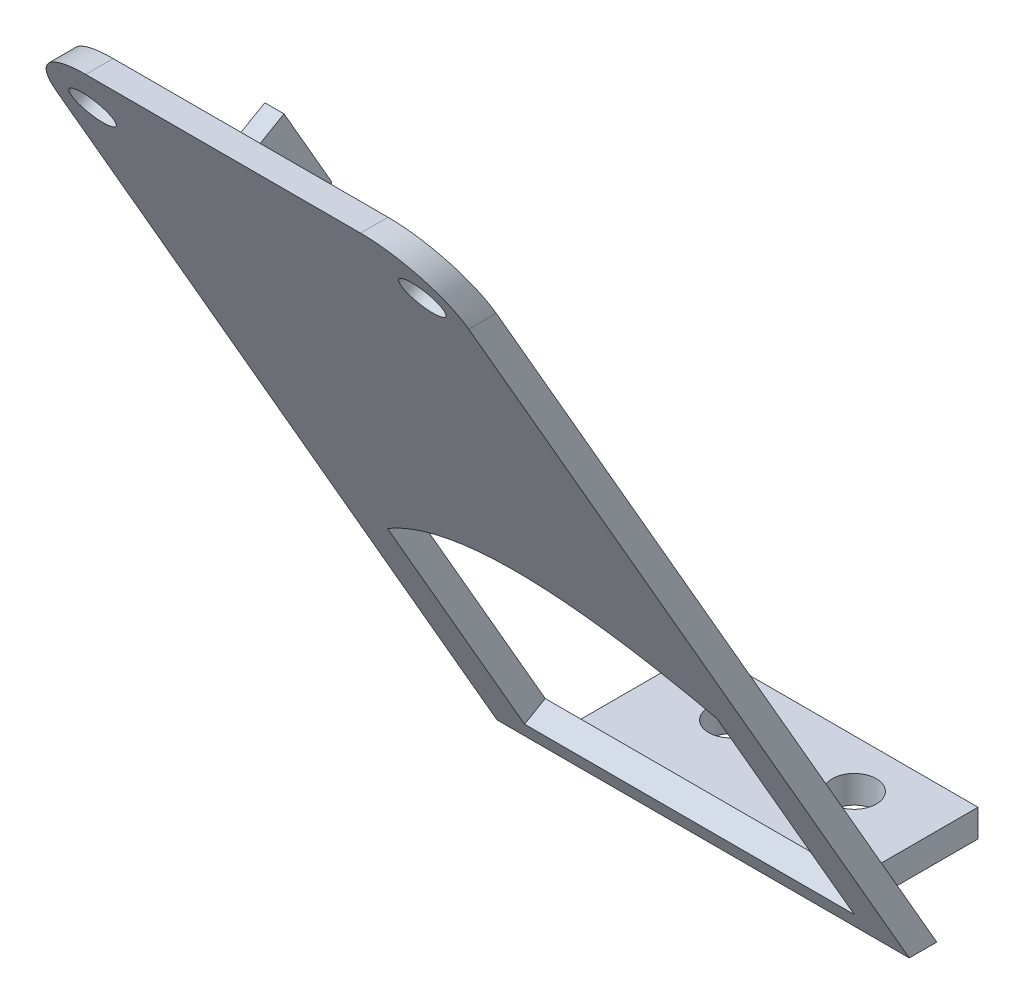
ISO-10303-21;
HEADER;
FILE_DESCRIPTION(('STEP AP214'),'2;1');
FILE_NAME('part.step','',(''),(''),'','','');
FILE_SCHEMA(('AUTOMOTIVE_DESIGN { 1 0 10303 214 1 1 1 1 }'));
ENDSEC;
DATA;
#1=APPLICATION_CONTEXT('core data for automotive mechanical design processes');
#2=APPLICATION_PROTOCOL_DEFINITION('international standard','automotive_design',2000,#1);
#3=PRODUCT_CONTEXT('',#1,'mechanical');
#4=PRODUCT('Part','Part','',(#3));
#5=PRODUCT_RELATED_PRODUCT_CATEGORY('part','',(#4));
#6=PRODUCT_DEFINITION_FORMATION('','',#4);
#7=PRODUCT_DEFINITION_CONTEXT('part definition',#1,'design');
#8=PRODUCT_DEFINITION('design','',#6,#7);
#9=PRODUCT_DEFINITION_SHAPE('','',#8);
#10=(LENGTH_UNIT() NAMED_UNIT(*) SI_UNIT(.MILLI.,.METRE.));
#11=(NAMED_UNIT(*) PLANE_ANGLE_UNIT() SI_UNIT($,.RADIAN.));
#12=(NAMED_UNIT(*) SI_UNIT($,.STERADIAN.) SOLID_ANGLE_UNIT());
#13=UNCERTAINTY_MEASURE_WITH_UNIT(LENGTH_MEASURE(1.E-05),#10,'distance_accuracy_value','');
#14=(GEOMETRIC_REPRESENTATION_CONTEXT(3) GLOBAL_UNCERTAINTY_ASSIGNED_CONTEXT((#13)) GLOBAL_UNIT_ASSIGNED_CONTEXT((#10,
#11,#12)) REPRESENTATION_CONTEXT('',''));
#15=CARTESIAN_POINT('',(0.,0.,0.));
#16=DIRECTION('',(0.,0.,1.));
#17=DIRECTION('',(1.,0.,0.));
#18=AXIS2_PLACEMENT_3D('',#15,#16,#17);
#19=CARTESIAN_POINT('',(15.,0.,3.));
#20=DIRECTION('',(0.,-0.499134172719353,0.866524712644577));
#21=DIRECTION('',(0.,-0.866524712644577,-0.499134172719353));
#22=AXIS2_PLACEMENT_3D('',#19,#20,#21);
#23=PLANE('',#22);
#24=CARTESIAN_POINT('',(12.,57.1906310345421,35.9428553994773));
#25=DIRECTION('',(0.,0.499134172719353,-0.866524712644577));
#26=DIRECTION('',(0.,0.866524712644577,0.499134172719353));
#27=AXIS2_PLACEMENT_3D('',#24,#25,#26);
#28=CIRCLE('',#27,1.54999999999999);
#29=CARTESIAN_POINT('',(12.,58.5337443391412,36.7165133671923));
#30=VERTEX_POINT('',#29);
#31=EDGE_CURVE('E199',#30,#30,#28,.T.);
#32=ORIENTED_EDGE('',*,*,#31,.F.);
#33=EDGE_LOOP('',(#32));
#34=FACE_BOUND('',#33,.T.);
#35=CARTESIAN_POINT('',(-12.,57.1906310345421,35.9428553994773));
#36=DIRECTION('',(0.,0.499134172719353,-0.866524712644577));
#37=DIRECTION('',(0.,-0.866524712644577,-0.499134172719353));
#38=AXIS2_PLACEMENT_3D('',#35,#36,#37);
#39=CIRCLE('',#38,1.54999999999999);
#40=CARTESIAN_POINT('',(-12.,55.847517729943,35.1691974317623));
#41=VERTEX_POINT('',#40);
#42=EDGE_CURVE('E196',#41,#41,#39,.T.);
#43=ORIENTED_EDGE('',*,*,#42,.F.);
#44=EDGE_LOOP('',(#43));
#45=FACE_BOUND('',#44,.T.);
#46=DIRECTION('',(-1.,0.,0.));
#47=VECTOR('',#46,1.);
#48=CARTESIAN_POINT('',(-12.,2.59957413793374,4.49740251815807));
#49=LINE('',#48,#47);
#50=CARTESIAN_POINT('',(12.,2.59957413793374,4.49740251815807));
#51=VERTEX_POINT('',#50);
#52=CARTESIAN_POINT('',(-12.,2.59957413793374,4.49740251815807));
#53=VERTEX_POINT('',#52);
#54=EDGE_CURVE('E216',#51,#53,#49,.T.);
#55=ORIENTED_EDGE('',*,*,#54,.F.);
#56=DIRECTION('',(0.,-0.866524712644577,-0.499134172719353));
#57=VECTOR('',#56,1.);
#58=CARTESIAN_POINT('',(12.,19.9300683908253,14.4800859725451));
#59=LINE('',#58,#57);
#60=CARTESIAN_POINT('',(12.,19.9300683908253,14.4800859725451));
#61=VERTEX_POINT('',#60);
#62=EDGE_CURVE('E64',#61,#51,#59,.T.);
#63=ORIENTED_EDGE('',*,*,#62,.F.);
#64=CARTESIAN_POINT('',(-12.,19.9300683908253,14.4800859725451));
#65=CARTESIAN_POINT('',(0.,29.2138586065739,19.8277198962165));
#66=CARTESIAN_POINT('',(12.,19.9300683908253,14.4800859725451));
#67=B_SPLINE_CURVE_WITH_KNOTS('',2,(#64,#65,#66),.UNSPECIFIED.,.F.,.F.,(3,3),(0.,1.),.UNSPECIFIED.);
#68=CARTESIAN_POINT('',(-12.,19.9300683908253,14.4800859725451));
#69=VERTEX_POINT('',#68);
#70=EDGE_CURVE('E202',#69,#61,#67,.T.);
#71=ORIENTED_EDGE('',*,*,#70,.F.);
#72=DIRECTION('',(0.,0.866524712644577,0.499134172719353));
#73=VECTOR('',#72,1.);
#74=CARTESIAN_POINT('',(-12.,19.9300683908253,14.4800859725451));
#75=LINE('',#74,#73);
#76=EDGE_CURVE('E210',#53,#69,#75,.T.);
#77=ORIENTED_EDGE('',*,*,#76,.F.);
#78=EDGE_LOOP('',(#55,#63,#71,#77));
#79=FACE_BOUND('',#78,.T.);
#80=DIRECTION('',(0.,0.866524712644577,0.499134172719354));
#81=VECTOR('',#80,1.);
#82=CARTESIAN_POINT('',(-0.699999999999999,60.6567298851204,37.9393920903547));
#83=LINE('',#82,#81);
#84=CARTESIAN_POINT('',(-0.7,54.5910568966084,34.4454528813192));
#85=VERTEX_POINT('',#84);
#86=CARTESIAN_POINT('',(-0.699999999999999,60.6567298851204,37.9393920903547));
#87=VERTEX_POINT('',#86);
#88=EDGE_CURVE('E56',#85,#87,#83,.T.);
#89=ORIENTED_EDGE('',*,*,#88,.F.);
#90=DIRECTION('',(-1.,0.,0.));
#91=VECTOR('',#90,1.);
#92=CARTESIAN_POINT('',(0.7,54.5910568966084,34.4454528813192));
#93=LINE('',#92,#91);
#94=CARTESIAN_POINT('',(0.7,54.5910568966084,34.4454528813192));
#95=VERTEX_POINT('',#94);
#96=EDGE_CURVE('E185',#95,#85,#93,.T.);
#97=ORIENTED_EDGE('',*,*,#96,.F.);
#98=DIRECTION('',(0.,-0.866524712644577,-0.499134172719354));
#99=VECTOR('',#98,1.);
#100=CARTESIAN_POINT('',(0.700000000000001,60.6567298851204,37.9393920903547));
#101=LINE('',#100,#99);
#102=CARTESIAN_POINT('',(0.700000000000001,60.6567298851204,37.9393920903547));
#103=VERTEX_POINT('',#102);
#104=EDGE_CURVE('E519',#103,#95,#101,.T.);
#105=ORIENTED_EDGE('',*,*,#104,.F.);
#106=DIRECTION('',(-1.,0.,0.));
#107=VECTOR('',#106,1.);
#108=CARTESIAN_POINT('',(15.,60.6567298851204,37.9393920903547));
#109=LINE('',#108,#107);
#110=CARTESIAN_POINT('',(10.,60.6567298851204,37.9393920903547));
#111=VERTEX_POINT('',#110);
#112=EDGE_CURVE('E532',#111,#103,#109,.T.);
#113=ORIENTED_EDGE('',*,*,#112,.F.);
#114=CARTESIAN_POINT('',(10.,55.6567298851204,35.0593001239293));
#115=DIRECTION('',(0.,-0.499134172719353,0.866524712644577));
#116=DIRECTION('',(0.,0.866524712644577,0.499134172719353));
#117=AXIS2_PLACEMENT_3D('',#114,#115,#116);
#118=ELLIPSE('',#117,5.77017588424031,5.);
#119=CARTESIAN_POINT('',(15.,55.6567298851204,35.0593001239293));
#120=VERTEX_POINT('',#119);
#121=EDGE_CURVE('E306',#111,#120,#118,.F.);
#122=ORIENTED_EDGE('',*,*,#121,.T.);
#123=DIRECTION('',(0.,0.866524712644577,0.499134172719353));
#124=VECTOR('',#123,1.);
#125=CARTESIAN_POINT('',(15.,0.,3.));
#126=LINE('',#125,#124);
#127=CARTESIAN_POINT('',(15.,0.,3.));
#128=VERTEX_POINT('',#127);
#129=EDGE_CURVE('E606',#128,#120,#126,.T.);
#130=ORIENTED_EDGE('',*,*,#129,.F.);
#131=DIRECTION('',(-1.,0.,0.));
#132=VECTOR('',#131,1.);
#133=CARTESIAN_POINT('',(15.,0.,3.));
#134=LINE('',#133,#132);
#135=CARTESIAN_POINT('',(10.,0.,3.));
#136=VERTEX_POINT('',#135);
#137=EDGE_CURVE('E539',#128,#136,#134,.T.);
#138=ORIENTED_EDGE('',*,*,#137,.T.);
#139=DIRECTION('',(0.,0.866524712644577,0.499134172719353));
#140=VECTOR('',#139,1.);
#141=CARTESIAN_POINT('',(10.,-1.95836660944628,1.87194481216359));
#142=LINE('',#141,#140);
#143=CARTESIAN_POINT('',(10.,2.,4.15203678657018));
#144=VERTEX_POINT('',#143);
#145=EDGE_CURVE('E548',#136,#144,#142,.T.);
#146=ORIENTED_EDGE('',*,*,#145,.T.);
#147=DIRECTION('',(1.,0.,0.));
#148=VECTOR('',#147,1.);
#149=CARTESIAN_POINT('',(0.,2.,4.15203678657018));
#150=LINE('',#149,#148);
#151=CARTESIAN_POINT('',(-9.99999999999999,2.,4.15203678657018));
#152=VERTEX_POINT('',#151);
#153=EDGE_CURVE('E546',#152,#144,#150,.T.);
#154=ORIENTED_EDGE('',*,*,#153,.F.);
#155=DIRECTION('',(0.,-0.866524712644577,-0.499134172719353));
#156=VECTOR('',#155,1.);
#157=CARTESIAN_POINT('',(-9.99999999999999,-1.95836660944628,1.87194481216359));
#158=LINE('',#157,#156);
#159=CARTESIAN_POINT('',(-9.99999999999999,0.,3.));
#160=VERTEX_POINT('',#159);
#161=EDGE_CURVE('E585',#152,#160,#158,.T.);
#162=ORIENTED_EDGE('',*,*,#161,.T.);
#163=CARTESIAN_POINT('',(-15.,0.,3.));
#164=VERTEX_POINT('',#163);
#165=EDGE_CURVE('E537',#160,#164,#134,.T.);
#166=ORIENTED_EDGE('',*,*,#165,.T.);
#167=DIRECTION('',(0.,0.866524712644577,0.499134172719353));
#168=VECTOR('',#167,1.);
#169=CARTESIAN_POINT('',(-15.,0.,3.));
#170=LINE('',#169,#168);
#171=CARTESIAN_POINT('',(-15.,55.6567298851204,35.0593001239293));
#172=VERTEX_POINT('',#171);
#173=EDGE_CURVE('E596',#164,#172,#170,.T.);
#174=ORIENTED_EDGE('',*,*,#173,.T.);
#175=CARTESIAN_POINT('',(-10.,55.6567298851204,35.0593001239293));
#176=DIRECTION('',(0.,-0.499134172719353,0.866524712644577));
#177=DIRECTION('',(0.,-0.866524712644577,-0.499134172719353));
#178=AXIS2_PLACEMENT_3D('',#175,#176,#177);
#179=ELLIPSE('',#178,5.77017588424031,5.);
#180=CARTESIAN_POINT('',(-10.,60.6567298851204,37.9393920903547));
#181=VERTEX_POINT('',#180);
#182=EDGE_CURVE('E299',#172,#181,#179,.F.);
#183=ORIENTED_EDGE('',*,*,#182,.T.);
#184=EDGE_CURVE('E522',#87,#181,#109,.T.);
#185=ORIENTED_EDGE('',*,*,#184,.F.);
#186=EDGE_LOOP('',(#89,#97,#105,#113,#122,#130,#138,#146,#154,#162,#166,#174,#183,#185));
#187=FACE_BOUND('',#186,.T.);
#188=ADVANCED_FACE('F41',(#34,#45,#79,#187),#23,.F.);
#189=CARTESIAN_POINT('',(0.,2.,0.));
#190=DIRECTION('',(0.,1.,0.));
#191=DIRECTION('',(0.,0.,1.));
#192=AXIS2_PLACEMENT_3D('',#189,#190,#191);
#193=PLANE('',#192);
#194=CARTESIAN_POINT('',(-4.5,2.,-1.5));
#195=DIRECTION('',(0.,1.,0.));
#196=DIRECTION('',(0.,0.,1.));
#197=AXIS2_PLACEMENT_3D('',#194,#195,#196);
#198=CIRCLE('',#197,1.6);
#199=CARTESIAN_POINT('',(-4.5,2.,0.0999999999999987));
#200=VERTEX_POINT('',#199);
#201=EDGE_CURVE('E558',#200,#200,#198,.T.);
#202=ORIENTED_EDGE('',*,*,#201,.F.);
#203=EDGE_LOOP('',(#202));
#204=FACE_BOUND('',#203,.T.);
#205=CARTESIAN_POINT('',(4.5,2.,-1.5));
#206=DIRECTION('',(0.,1.,0.));
#207=DIRECTION('',(0.,0.,-1.));
#208=AXIS2_PLACEMENT_3D('',#205,#206,#207);
#209=CIRCLE('',#208,1.6);
#210=CARTESIAN_POINT('',(4.5,2.,-3.1));
#211=VERTEX_POINT('',#210);
#212=EDGE_CURVE('E552',#211,#211,#209,.T.);
#213=ORIENTED_EDGE('',*,*,#212,.F.);
#214=EDGE_LOOP('',(#213));
#215=FACE_BOUND('',#214,.T.);
#216=DIRECTION('',(0.,0.,1.));
#217=VECTOR('',#216,1.);
#218=CARTESIAN_POINT('',(-10.,2.,-5.));
#219=LINE('',#218,#217);
#220=CARTESIAN_POINT('',(-10.,2.,-5.));
#221=VERTEX_POINT('',#220);
#222=EDGE_CURVE('E569',#221,#152,#219,.T.);
#223=ORIENTED_EDGE('',*,*,#222,.T.);
#224=ORIENTED_EDGE('',*,*,#153,.T.);
#225=DIRECTION('',(0.,0.,-1.));
#226=VECTOR('',#225,1.);
#227=CARTESIAN_POINT('',(10.,2.,-5.));
#228=LINE('',#227,#226);
#229=CARTESIAN_POINT('',(10.,2.,-5.));
#230=VERTEX_POINT('',#229);
#231=EDGE_CURVE('E564',#144,#230,#228,.T.);
#232=ORIENTED_EDGE('',*,*,#231,.T.);
#233=DIRECTION('',(-1.,0.,0.));
#234=VECTOR('',#233,1.);
#235=CARTESIAN_POINT('',(-10.,2.,-5.));
#236=LINE('',#235,#234);
#237=EDGE_CURVE('E566',#230,#221,#236,.T.);
#238=ORIENTED_EDGE('',*,*,#237,.T.);
#239=EDGE_LOOP('',(#223,#224,#232,#238));
#240=FACE_BOUND('',#239,.T.);
#241=ADVANCED_FACE('F258',(#204,#215,#240),#193,.T.);
#242=CARTESIAN_POINT('',(10.,2.,-5.));
#243=DIRECTION('',(-1.,0.,0.));
#244=DIRECTION('',(0.,0.,1.));
#245=AXIS2_PLACEMENT_3D('',#242,#243,#244);
#246=PLANE('',#245);
#247=ORIENTED_EDGE('',*,*,#145,.F.);
#248=DIRECTION('',(0.,0.,-1.));
#249=VECTOR('',#248,1.);
#250=CARTESIAN_POINT('',(10.,0.,-5.));
#251=LINE('',#250,#249);
#252=CARTESIAN_POINT('',(10.,0.,-5.));
#253=VERTEX_POINT('',#252);
#254=EDGE_CURVE('E561',#136,#253,#251,.T.);
#255=ORIENTED_EDGE('',*,*,#254,.T.);
#256=DIRECTION('',(0.,-1.,0.));
#257=VECTOR('',#256,1.);
#258=CARTESIAN_POINT('',(10.,2.,-5.));
#259=LINE('',#258,#257);
#260=EDGE_CURVE('E582',#230,#253,#259,.T.);
#261=ORIENTED_EDGE('',*,*,#260,.F.);
#262=ORIENTED_EDGE('',*,*,#231,.F.);
#263=EDGE_LOOP('',(#247,#255,#261,#262));
#264=FACE_BOUND('',#263,.T.);
#265=ADVANCED_FACE('F274',(#264),#246,.F.);
#266=CARTESIAN_POINT('',(-10.,2.,-5.));
#267=DIRECTION('',(1.,0.,0.));
#268=DIRECTION('',(0.,0.,-1.));
#269=AXIS2_PLACEMENT_3D('',#266,#267,#268);
#270=PLANE('',#269);
#271=ORIENTED_EDGE('',*,*,#161,.F.);
#272=ORIENTED_EDGE('',*,*,#222,.F.);
#273=DIRECTION('',(0.,-1.,0.));
#274=VECTOR('',#273,1.);
#275=CARTESIAN_POINT('',(-10.,2.,-5.));
#276=LINE('',#275,#274);
#277=CARTESIAN_POINT('',(-10.,0.,-5.));
#278=VERTEX_POINT('',#277);
#279=EDGE_CURVE('E572',#221,#278,#276,.T.);
#280=ORIENTED_EDGE('',*,*,#279,.T.);
#281=DIRECTION('',(0.,0.,1.));
#282=VECTOR('',#281,1.);
#283=CARTESIAN_POINT('',(-10.,0.,-5.));
#284=LINE('',#283,#282);
#285=EDGE_CURVE('E576',#278,#160,#284,.T.);
#286=ORIENTED_EDGE('',*,*,#285,.T.);
#287=EDGE_LOOP('',(#271,#272,#280,#286));
#288=FACE_BOUND('',#287,.T.);
#289=ADVANCED_FACE('F279',(#288),#270,.F.);
#290=CARTESIAN_POINT('',(0.,0.,0.));
#291=DIRECTION('',(0.,1.,0.));
#292=DIRECTION('',(0.,0.,1.));
#293=AXIS2_PLACEMENT_3D('',#290,#291,#292);
#294=PLANE('',#293);
#295=DIRECTION('',(1.,0.,0.));
#296=VECTOR('',#295,1.);
#297=CARTESIAN_POINT('',(-9.99999999999999,0.,5.));
#298=LINE('',#297,#296);
#299=CARTESIAN_POINT('',(-15.,0.,5.));
#300=VERTEX_POINT('',#299);
#301=CARTESIAN_POINT('',(15.,0.,5.));
#302=VERTEX_POINT('',#301);
#303=EDGE_CURVE('E567',#300,#302,#298,.T.);
#304=ORIENTED_EDGE('',*,*,#303,.F.);
#305=DIRECTION('',(0.,0.,-1.));
#306=VECTOR('',#305,1.);
#307=CARTESIAN_POINT('',(-15.,0.,5.));
#308=LINE('',#307,#306);
#309=EDGE_CURVE('E600',#300,#164,#308,.T.);
#310=ORIENTED_EDGE('',*,*,#309,.T.);
#311=ORIENTED_EDGE('',*,*,#165,.F.);
#312=ORIENTED_EDGE('',*,*,#285,.F.);
#313=DIRECTION('',(-1.,0.,0.));
#314=VECTOR('',#313,1.);
#315=CARTESIAN_POINT('',(-10.,0.,-5.));
#316=LINE('',#315,#314);
#317=EDGE_CURVE('E574',#253,#278,#316,.T.);
#318=ORIENTED_EDGE('',*,*,#317,.F.);
#319=ORIENTED_EDGE('',*,*,#254,.F.);
#320=ORIENTED_EDGE('',*,*,#137,.F.);
#321=DIRECTION('',(0.,0.,-1.));
#322=VECTOR('',#321,1.);
#323=CARTESIAN_POINT('',(15.,0.,5.));
#324=LINE('',#323,#322);
#325=EDGE_CURVE('E602',#302,#128,#324,.T.);
#326=ORIENTED_EDGE('',*,*,#325,.F.);
#327=EDGE_LOOP('',(#304,#310,#311,#312,#318,#319,#320,#326));
#328=FACE_BOUND('',#327,.T.);
#329=CARTESIAN_POINT('',(4.5,0.,-1.5));
#330=DIRECTION('',(0.,1.,0.));
#331=DIRECTION('',(0.,0.,-1.));
#332=AXIS2_PLACEMENT_3D('',#329,#330,#331);
#333=CIRCLE('',#332,1.6);
#334=CARTESIAN_POINT('',(4.5,0.,-3.1));
#335=VERTEX_POINT('',#334);
#336=EDGE_CURVE('E551',#335,#335,#333,.T.);
#337=ORIENTED_EDGE('',*,*,#336,.T.);
#338=EDGE_LOOP('',(#337));
#339=FACE_BOUND('',#338,.T.);
#340=CARTESIAN_POINT('',(-4.5,0.,-1.5));
#341=DIRECTION('',(0.,1.,0.));
#342=DIRECTION('',(0.,0.,1.));
#343=AXIS2_PLACEMENT_3D('',#340,#341,#342);
#344=CIRCLE('',#343,1.6);
#345=CARTESIAN_POINT('',(-4.5,0.,0.0999999999999987));
#346=VERTEX_POINT('',#345);
#347=EDGE_CURVE('E555',#346,#346,#344,.T.);
#348=ORIENTED_EDGE('',*,*,#347,.T.);
#349=EDGE_LOOP('',(#348));
#350=FACE_BOUND('',#349,.T.);
#351=ADVANCED_FACE('F276',(#328,#339,#350),#294,.F.);
#352=CARTESIAN_POINT('',(-10.,2.,-5.));
#353=DIRECTION('',(0.,0.,1.));
#354=DIRECTION('',(1.,0.,0.));
#355=AXIS2_PLACEMENT_3D('',#352,#353,#354);
#356=PLANE('',#355);
#357=ORIENTED_EDGE('',*,*,#317,.T.);
#358=ORIENTED_EDGE('',*,*,#279,.F.);
#359=ORIENTED_EDGE('',*,*,#237,.F.);
#360=ORIENTED_EDGE('',*,*,#260,.T.);
#361=EDGE_LOOP('',(#357,#358,#359,#360));
#362=FACE_BOUND('',#361,.T.);
#363=ADVANCED_FACE('F270',(#362),#356,.F.);
#364=CARTESIAN_POINT('',(-4.5,2.,-1.5));
#365=DIRECTION('',(0.,-1.,0.));
#366=DIRECTION('',(0.,0.,-1.));
#367=AXIS2_PLACEMENT_3D('',#364,#365,#366);
#368=CYLINDRICAL_SURFACE('',#367,1.6);
#369=ORIENTED_EDGE('',*,*,#201,.T.);
#370=EDGE_LOOP('',(#369));
#371=FACE_BOUND('',#370,.T.);
#372=ORIENTED_EDGE('',*,*,#347,.F.);
#373=EDGE_LOOP('',(#372));
#374=FACE_BOUND('',#373,.T.);
#375=ADVANCED_FACE('F266',(#371,#374),#368,.F.);
#376=CARTESIAN_POINT('',(4.5,2.,-1.5));
#377=DIRECTION('',(0.,-1.,0.));
#378=DIRECTION('',(0.,0.,-1.));
#379=AXIS2_PLACEMENT_3D('',#376,#377,#378);
#380=CYLINDRICAL_SURFACE('',#379,1.6);
#381=ORIENTED_EDGE('',*,*,#212,.T.);
#382=EDGE_LOOP('',(#381));
#383=FACE_BOUND('',#382,.T.);
#384=ORIENTED_EDGE('',*,*,#336,.F.);
#385=EDGE_LOOP('',(#384));
#386=FACE_BOUND('',#385,.T.);
#387=ADVANCED_FACE('F262',(#383,#386),#380,.F.);
#388=CARTESIAN_POINT('',(15.,0.,5.));
#389=DIRECTION('',(0.,0.499134172719353,-0.866524712644577));
#390=DIRECTION('',(0.,0.866524712644577,0.499134172719353));
#391=AXIS2_PLACEMENT_3D('',#388,#389,#390);
#392=PLANE('',#391);
#393=CARTESIAN_POINT('',(-12.,19.0650441996518,15.9818161277926));
#394=CARTESIAN_POINT('',(0.,28.3488344154005,21.329450051464));
#395=CARTESIAN_POINT('',(12.,19.0650441996518,15.9818161277927));
#396=B_SPLINE_CURVE_WITH_KNOTS('',2,(#393,#394,#395),.UNSPECIFIED.,.F.,.F.,(3,3),(0.,1.),.UNSPECIFIED.);
#397=CARTESIAN_POINT('',(-12.,19.0650441996518,15.9818161277927));
#398=VERTEX_POINT('',#397);
#399=CARTESIAN_POINT('',(12.,19.0650441996518,15.9818161277927));
#400=VERTEX_POINT('',#399);
#401=EDGE_CURVE('E49',#398,#400,#396,.T.);
#402=ORIENTED_EDGE('',*,*,#401,.T.);
#403=DIRECTION('',(0.,-0.866524712644577,-0.499134172719353));
#404=VECTOR('',#403,1.);
#405=CARTESIAN_POINT('',(12.,0.,5.));
#406=LINE('',#405,#404);
#407=CARTESIAN_POINT('',(12.,1.73454994676029,5.9991326734056));
#408=VERTEX_POINT('',#407);
#409=EDGE_CURVE('E11',#400,#408,#406,.T.);
#410=ORIENTED_EDGE('',*,*,#409,.T.);
#411=DIRECTION('',(-1.,0.,0.));
#412=VECTOR('',#411,1.);
#413=CARTESIAN_POINT('',(15.,1.73454994676029,5.9991326734056));
#414=LINE('',#413,#412);
#415=CARTESIAN_POINT('',(-12.,1.73454994676029,5.9991326734056));
#416=VERTEX_POINT('',#415);
#417=EDGE_CURVE('E309',#408,#416,#414,.T.);
#418=ORIENTED_EDGE('',*,*,#417,.T.);
#419=DIRECTION('',(0.,0.866524712644577,0.499134172719353));
#420=VECTOR('',#419,1.);
#421=CARTESIAN_POINT('',(-12.,0.,5.));
#422=LINE('',#421,#420);
#423=EDGE_CURVE('E323',#416,#398,#422,.T.);
#424=ORIENTED_EDGE('',*,*,#423,.T.);
#425=EDGE_LOOP('',(#402,#410,#418,#424));
#426=FACE_BOUND('',#425,.T.);
#427=CARTESIAN_POINT('',(-12.,56.3256068433687,37.4445855547248));
#428=DIRECTION('',(0.,0.499134172719353,-0.866524712644577));
#429=DIRECTION('',(0.,0.866524712644577,0.499134172719353));
#430=AXIS2_PLACEMENT_3D('',#427,#428,#429);
#431=CIRCLE('',#430,1.54999999999999);
#432=CARTESIAN_POINT('',(-12.,57.6687201479678,38.2182435224398));
#433=VERTEX_POINT('',#432);
#434=EDGE_CURVE('E317',#433,#433,#431,.T.);
#435=ORIENTED_EDGE('',*,*,#434,.T.);
#436=EDGE_LOOP('',(#435));
#437=FACE_BOUND('',#436,.T.);
#438=CARTESIAN_POINT('',(12.,56.3256068433687,37.4445855547248));
#439=DIRECTION('',(0.,0.499134172719353,-0.866524712644577));
#440=DIRECTION('',(0.,0.866524712644577,0.499134172719353));
#441=AXIS2_PLACEMENT_3D('',#438,#439,#440);
#442=CIRCLE('',#441,1.54999999999999);
#443=CARTESIAN_POINT('',(12.,57.6687201479678,38.2182435224398));
#444=VERTEX_POINT('',#443);
#445=EDGE_CURVE('E314',#444,#444,#442,.T.);
#446=ORIENTED_EDGE('',*,*,#445,.T.);
#447=EDGE_LOOP('',(#446));
#448=FACE_BOUND('',#447,.T.);
#449=DIRECTION('',(-1.,0.,0.));
#450=VECTOR('',#449,1.);
#451=CARTESIAN_POINT('',(15.,60.6567298851204,39.9393920903547));
#452=LINE('',#451,#450);
#453=CARTESIAN_POINT('',(10.,60.6567298851204,39.9393920903547));
#454=VERTEX_POINT('',#453);
#455=CARTESIAN_POINT('',(-10.,60.6567298851204,39.9393920903547));
#456=VERTEX_POINT('',#455);
#457=EDGE_CURVE('E541',#454,#456,#452,.T.);
#458=ORIENTED_EDGE('',*,*,#457,.T.);
#459=CARTESIAN_POINT('',(-10.,55.6567298851204,37.0593001239293));
#460=DIRECTION('',(0.,0.499134172719353,-0.866524712644577));
#461=DIRECTION('',(0.,-0.866524712644577,-0.499134172719353));
#462=AXIS2_PLACEMENT_3D('',#459,#460,#461);
#463=ELLIPSE('',#462,5.77017588424031,5.);
#464=CARTESIAN_POINT('',(-15.,55.6567298851204,37.0593001239293));
#465=VERTEX_POINT('',#464);
#466=EDGE_CURVE('E592',#456,#465,#463,.F.);
#467=ORIENTED_EDGE('',*,*,#466,.T.);
#468=DIRECTION('',(0.,-0.866524712644577,-0.499134172719353));
#469=VECTOR('',#468,1.);
#470=CARTESIAN_POINT('',(-15.,0.,5.));
#471=LINE('',#470,#469);
#472=EDGE_CURVE('E320',#465,#300,#471,.T.);
#473=ORIENTED_EDGE('',*,*,#472,.T.);
#474=ORIENTED_EDGE('',*,*,#303,.T.);
#475=DIRECTION('',(0.,-0.866524712644577,-0.499134172719353));
#476=VECTOR('',#475,1.);
#477=CARTESIAN_POINT('',(15.,0.,5.));
#478=LINE('',#477,#476);
#479=CARTESIAN_POINT('',(15.,55.6567298851204,37.0593001239293));
#480=VERTEX_POINT('',#479);
#481=EDGE_CURVE('E599',#480,#302,#478,.T.);
#482=ORIENTED_EDGE('',*,*,#481,.F.);
#483=CARTESIAN_POINT('',(10.,55.6567298851204,37.0593001239293));
#484=DIRECTION('',(0.,0.499134172719353,-0.866524712644577));
#485=DIRECTION('',(0.,0.866524712644577,0.499134172719353));
#486=AXIS2_PLACEMENT_3D('',#483,#484,#485);
#487=ELLIPSE('',#486,5.77017588424031,5.);
#488=EDGE_CURVE('E590',#480,#454,#487,.F.);
#489=ORIENTED_EDGE('',*,*,#488,.T.);
#490=EDGE_LOOP('',(#458,#467,#473,#474,#482,#489));
#491=FACE_BOUND('',#490,.T.);
#492=ADVANCED_FACE('F254',(#426,#437,#448,#491),#392,.F.);
#493=CARTESIAN_POINT('',(15.,60.6567298851204,39.9393920903547));
#494=DIRECTION('',(0.,-1.,0.));
#495=DIRECTION('',(0.,0.,-1.));
#496=AXIS2_PLACEMENT_3D('',#493,#494,#495);
#497=PLANE('',#496);
#498=ORIENTED_EDGE('',*,*,#112,.T.);
#499=DIRECTION('',(1.,0.,0.));
#500=VECTOR('',#499,1.);
#501=CARTESIAN_POINT('',(0.700000000000001,60.6567298851204,37.9393920903547));
#502=LINE('',#501,#500);
#503=EDGE_CURVE('E524',#87,#103,#502,.T.);
#504=ORIENTED_EDGE('',*,*,#503,.F.);
#505=ORIENTED_EDGE('',*,*,#184,.T.);
#506=DIRECTION('',(0.,0.,1.));
#507=VECTOR('',#506,1.);
#508=CARTESIAN_POINT('',(-10.,60.6567298851204,39.9393920903547));
#509=LINE('',#508,#507);
#510=EDGE_CURVE('E302',#181,#456,#509,.T.);
#511=ORIENTED_EDGE('',*,*,#510,.T.);
#512=ORIENTED_EDGE('',*,*,#457,.F.);
#513=DIRECTION('',(0.,0.,1.));
#514=VECTOR('',#513,1.);
#515=CARTESIAN_POINT('',(10.,60.6567298851204,39.9393920903547));
#516=LINE('',#515,#514);
#517=EDGE_CURVE('E536',#454,#111,#516,.F.);
#518=ORIENTED_EDGE('',*,*,#517,.T.);
#519=EDGE_LOOP('',(#498,#504,#505,#511,#512,#518));
#520=FACE_BOUND('',#519,.T.);
#521=ADVANCED_FACE('F250',(#520),#497,.F.);
#522=CARTESIAN_POINT('',(15.,0.,0.));
#523=DIRECTION('',(-1.,0.,0.));
#524=DIRECTION('',(0.,0.,1.));
#525=AXIS2_PLACEMENT_3D('',#522,#523,#524);
#526=PLANE('',#525);
#527=ORIENTED_EDGE('',*,*,#129,.T.);
#528=DIRECTION('',(0.,0.,1.));
#529=VECTOR('',#528,1.);
#530=CARTESIAN_POINT('',(15.,55.6567298851204,0.));
#531=LINE('',#530,#529);
#532=EDGE_CURVE('E305',#120,#480,#531,.T.);
#533=ORIENTED_EDGE('',*,*,#532,.T.);
#534=ORIENTED_EDGE('',*,*,#481,.T.);
#535=ORIENTED_EDGE('',*,*,#325,.T.);
#536=EDGE_LOOP('',(#527,#533,#534,#535));
#537=FACE_BOUND('',#536,.T.);
#538=ADVANCED_FACE('F246',(#537),#526,.F.);
#539=CARTESIAN_POINT('',(-15.,0.,0.));
#540=DIRECTION('',(-1.,0.,0.));
#541=DIRECTION('',(0.,0.,1.));
#542=AXIS2_PLACEMENT_3D('',#539,#540,#541);
#543=PLANE('',#542);
#544=ORIENTED_EDGE('',*,*,#472,.F.);
#545=DIRECTION('',(0.,0.,1.));
#546=VECTOR('',#545,1.);
#547=CARTESIAN_POINT('',(-15.,55.6567298851204,37.9393920903547));
#548=LINE('',#547,#546);
#549=EDGE_CURVE('E300',#465,#172,#548,.F.);
#550=ORIENTED_EDGE('',*,*,#549,.T.);
#551=ORIENTED_EDGE('',*,*,#173,.F.);
#552=ORIENTED_EDGE('',*,*,#309,.F.);
#553=EDGE_LOOP('',(#544,#550,#551,#552));
#554=FACE_BOUND('',#553,.T.);
#555=ADVANCED_FACE('F242',(#554),#543,.T.);
#556=CARTESIAN_POINT('',(-10.,55.6567298851204,39.9393920903547));
#557=DIRECTION('',(0.,0.,-1.));
#558=DIRECTION('',(-1.,0.,0.));
#559=AXIS2_PLACEMENT_3D('',#556,#557,#558);
#560=CYLINDRICAL_SURFACE('',#559,5.);
#561=ORIENTED_EDGE('',*,*,#182,.F.);
#562=ORIENTED_EDGE('',*,*,#549,.F.);
#563=ORIENTED_EDGE('',*,*,#466,.F.);
#564=ORIENTED_EDGE('',*,*,#510,.F.);
#565=EDGE_LOOP('',(#561,#562,#563,#564));
#566=FACE_BOUND('',#565,.T.);
#567=ADVANCED_FACE('F245',(#566),#560,.T.);
#568=CARTESIAN_POINT('',(10.,55.6567298851204,0.));
#569=DIRECTION('',(0.,0.,1.));
#570=DIRECTION('',(1.,0.,0.));
#571=AXIS2_PLACEMENT_3D('',#568,#569,#570);
#572=CYLINDRICAL_SURFACE('',#571,5.);
#573=ORIENTED_EDGE('',*,*,#121,.F.);
#574=ORIENTED_EDGE('',*,*,#517,.F.);
#575=ORIENTED_EDGE('',*,*,#488,.F.);
#576=ORIENTED_EDGE('',*,*,#532,.F.);
#577=EDGE_LOOP('',(#573,#574,#575,#576));
#578=FACE_BOUND('',#577,.T.);
#579=ADVANCED_FACE('F43',(#578),#572,.T.);
#580=CARTESIAN_POINT('',(12.,52.1992893073486,44.6081025259231));
#581=DIRECTION('',(0.,0.499134172719353,-0.866524712644577));
#582=DIRECTION('',(0.,0.866524712644577,0.499134172719353));
#583=AXIS2_PLACEMENT_3D('',#580,#581,#582);
#584=CYLINDRICAL_SURFACE('',#583,1.54999999999999);
#585=ORIENTED_EDGE('',*,*,#31,.T.);
#586=EDGE_LOOP('',(#585));
#587=FACE_BOUND('',#586,.T.);
#588=ORIENTED_EDGE('',*,*,#445,.F.);
#589=EDGE_LOOP('',(#588));
#590=FACE_BOUND('',#589,.T.);
#591=ADVANCED_FACE('F237',(#587,#590),#584,.F.);
#592=CARTESIAN_POINT('',(-12.,52.1992893073486,44.6081025259231));
#593=DIRECTION('',(0.,0.499134172719353,-0.866524712644577));
#594=DIRECTION('',(0.,0.866524712644577,0.499134172719353));
#595=AXIS2_PLACEMENT_3D('',#592,#593,#594);
#596=CYLINDRICAL_SURFACE('',#595,1.54999999999999);
#597=ORIENTED_EDGE('',*,*,#42,.T.);
#598=EDGE_LOOP('',(#597));
#599=FACE_BOUND('',#598,.T.);
#600=ORIENTED_EDGE('',*,*,#434,.F.);
#601=EDGE_LOOP('',(#600));
#602=FACE_BOUND('',#601,.T.);
#603=ADVANCED_FACE('F240',(#599,#602),#596,.F.);
#604=CARTESIAN_POINT('',(12.,14.9387266636318,23.1453330989909));
#605=DIRECTION('',(1.,0.,0.));
#606=DIRECTION('',(0.,1.,0.));
#607=AXIS2_PLACEMENT_3D('',#604,#605,#606);
#608=PLANE('',#607);
#609=DIRECTION('',(0.,0.499134172719353,-0.866524712644577));
#610=VECTOR('',#609,1.);
#611=CARTESIAN_POINT('',(12.,14.9387266636318,23.1453330989909));
#612=LINE('',#611,#610);
#613=EDGE_CURVE('E188',#400,#61,#612,.T.);
#614=ORIENTED_EDGE('',*,*,#613,.T.);
#615=ORIENTED_EDGE('',*,*,#62,.T.);
#616=DIRECTION('',(0.,0.499134172719353,-0.866524712644577));
#617=VECTOR('',#616,1.);
#618=CARTESIAN_POINT('',(12.,-2.39176758925978,13.1626496446038));
#619=LINE('',#618,#617);
#620=EDGE_CURVE('E200',#408,#51,#619,.T.);
#621=ORIENTED_EDGE('',*,*,#620,.F.);
#622=ORIENTED_EDGE('',*,*,#409,.F.);
#623=EDGE_LOOP('',(#614,#615,#621,#622));
#624=FACE_BOUND('',#623,.T.);
#625=ADVANCED_FACE('F234',(#624),#608,.F.);
#626=CARTESIAN_POINT('',(-12.,14.9387266636317,23.1453330989909));
#627=CARTESIAN_POINT('',(0.,24.2225168793804,28.4929670226622));
#628=CARTESIAN_POINT('',(12.,14.9387266636318,23.1453330989909));
#629=B_SPLINE_CURVE_WITH_KNOTS('',2,(#626,#627,#628),.UNSPECIFIED.,.F.,.F.,(3,3),(0.,1.),.UNSPECIFIED.);
#630=DIRECTION('',(0.,0.499134172719353,-0.866524712644577));
#631=VECTOR('',#630,1.);
#632=SURFACE_OF_LINEAR_EXTRUSION('',#629,#631);
#633=DIRECTION('',(0.,0.499134172719353,-0.866524712644577));
#634=VECTOR('',#633,1.);
#635=CARTESIAN_POINT('',(-12.,14.9387266636318,23.1453330989909));
#636=LINE('',#635,#634);
#637=EDGE_CURVE('E190',#398,#69,#636,.T.);
#638=ORIENTED_EDGE('',*,*,#637,.T.);
#639=ORIENTED_EDGE('',*,*,#70,.T.);
#640=ORIENTED_EDGE('',*,*,#613,.F.);
#641=ORIENTED_EDGE('',*,*,#401,.F.);
#642=EDGE_LOOP('',(#638,#639,#640,#641));
#643=FACE_BOUND('',#642,.T.);
#644=ADVANCED_FACE('F229',(#643),#632,.F.);
#645=CARTESIAN_POINT('',(-12.,14.9387266636318,23.1453330989909));
#646=DIRECTION('',(-1.,0.,0.));
#647=DIRECTION('',(0.,-1.,0.));
#648=AXIS2_PLACEMENT_3D('',#645,#646,#647);
#649=PLANE('',#648);
#650=DIRECTION('',(0.,0.499134172719353,-0.866524712644577));
#651=VECTOR('',#650,1.);
#652=CARTESIAN_POINT('',(-12.,-2.39176758925978,13.1626496446038));
#653=LINE('',#652,#651);
#654=EDGE_CURVE('E203',#416,#53,#653,.T.);
#655=ORIENTED_EDGE('',*,*,#654,.T.);
#656=ORIENTED_EDGE('',*,*,#76,.T.);
#657=ORIENTED_EDGE('',*,*,#637,.F.);
#658=ORIENTED_EDGE('',*,*,#423,.F.);
#659=EDGE_LOOP('',(#655,#656,#657,#658));
#660=FACE_BOUND('',#659,.T.);
#661=ADVANCED_FACE('F233',(#660),#649,.F.);
#662=CARTESIAN_POINT('',(-12.,-2.39176758925978,13.1626496446038));
#663=DIRECTION('',(0.,-0.866524712644577,-0.499134172719353));
#664=DIRECTION('',(0.,0.499134172719353,-0.866524712644577));
#665=AXIS2_PLACEMENT_3D('',#662,#663,#664);
#666=PLANE('',#665);
#667=ORIENTED_EDGE('',*,*,#620,.T.);
#668=ORIENTED_EDGE('',*,*,#54,.T.);
#669=ORIENTED_EDGE('',*,*,#654,.F.);
#670=ORIENTED_EDGE('',*,*,#417,.F.);
#671=EDGE_LOOP('',(#667,#668,#669,#670));
#672=FACE_BOUND('',#671,.T.);
#673=ADVANCED_FACE('F341',(#672),#666,.F.);
#674=CARTESIAN_POINT('',(-0.699999999999999,61.6549982305591,36.2063426650656));
#675=DIRECTION('',(1.,0.,0.));
#676=DIRECTION('',(0.,1.,0.));
#677=AXIS2_PLACEMENT_3D('',#674,#675,#676);
#678=PLANE('',#677);
#679=ORIENTED_EDGE('',*,*,#88,.T.);
#680=DIRECTION('',(0.,-0.499134172719353,0.866524712644577));
#681=VECTOR('',#680,1.);
#682=CARTESIAN_POINT('',(-0.699999999999999,61.6549982305591,36.2063426650656));
#683=LINE('',#682,#681);
#684=CARTESIAN_POINT('',(-0.699999999999999,61.6549982305591,36.2063426650656));
#685=VERTEX_POINT('',#684);
#686=EDGE_CURVE('E171',#685,#87,#683,.T.);
#687=ORIENTED_EDGE('',*,*,#686,.F.);
#688=DIRECTION('',(0.,0.866524712644577,0.499134172719354));
#689=VECTOR('',#688,1.);
#690=CARTESIAN_POINT('',(-0.699999999999999,61.6549982305591,36.2063426650656));
#691=LINE('',#690,#689);
#692=CARTESIAN_POINT('',(-0.7,55.5893252420471,32.7124034560301));
#693=VERTEX_POINT('',#692);
#694=EDGE_CURVE('E178',#693,#685,#691,.T.);
#695=ORIENTED_EDGE('',*,*,#694,.F.);
#696=DIRECTION('',(0.,-0.499134172719353,0.866524712644577));
#697=VECTOR('',#696,1.);
#698=CARTESIAN_POINT('',(-0.7,55.5893252420471,32.7124034560301));
#699=LINE('',#698,#697);
#700=EDGE_CURVE('E516',#693,#85,#699,.T.);
#701=ORIENTED_EDGE('',*,*,#700,.T.);
#702=EDGE_LOOP('',(#679,#687,#695,#701));
#703=FACE_BOUND('',#702,.T.);
#704=ADVANCED_FACE('F187',(#703),#678,.F.);
#705=CARTESIAN_POINT('',(0.700000000000001,61.6549982305591,36.2063426650656));
#706=DIRECTION('',(0.,-0.866524712644577,-0.499134172719353));
#707=DIRECTION('',(0.,0.499134172719353,-0.866524712644577));
#708=AXIS2_PLACEMENT_3D('',#705,#706,#707);
#709=PLANE('',#708);
#710=ORIENTED_EDGE('',*,*,#503,.T.);
#711=DIRECTION('',(0.,-0.499134172719353,0.866524712644577));
#712=VECTOR('',#711,1.);
#713=CARTESIAN_POINT('',(0.700000000000001,61.6549982305591,36.2063426650656));
#714=LINE('',#713,#712);
#715=CARTESIAN_POINT('',(0.700000000000001,61.6549982305591,36.2063426650656));
#716=VERTEX_POINT('',#715);
#717=EDGE_CURVE('E174',#716,#103,#714,.T.);
#718=ORIENTED_EDGE('',*,*,#717,.F.);
#719=DIRECTION('',(1.,0.,0.));
#720=VECTOR('',#719,1.);
#721=CARTESIAN_POINT('',(0.700000000000001,61.6549982305591,36.2063426650656));
#722=LINE('',#721,#720);
#723=EDGE_CURVE('E168',#685,#716,#722,.T.);
#724=ORIENTED_EDGE('',*,*,#723,.F.);
#725=ORIENTED_EDGE('',*,*,#686,.T.);
#726=EDGE_LOOP('',(#710,#718,#724,#725));
#727=FACE_BOUND('',#726,.T.);
#728=ADVANCED_FACE('F170',(#727),#709,.F.);
#729=CARTESIAN_POINT('',(0.700000000000001,61.6549982305591,36.2063426650656));
#730=DIRECTION('',(-1.,0.,0.));
#731=DIRECTION('',(0.,-1.,0.));
#732=AXIS2_PLACEMENT_3D('',#729,#730,#731);
#733=PLANE('',#732);
#734=ORIENTED_EDGE('',*,*,#104,.T.);
#735=DIRECTION('',(0.,-0.499134172719353,0.866524712644577));
#736=VECTOR('',#735,1.);
#737=CARTESIAN_POINT('',(0.7,55.5893252420471,32.7124034560301));
#738=LINE('',#737,#736);
#739=CARTESIAN_POINT('',(0.7,55.5893252420471,32.7124034560301));
#740=VERTEX_POINT('',#739);
#741=EDGE_CURVE('E192',#740,#95,#738,.T.);
#742=ORIENTED_EDGE('',*,*,#741,.F.);
#743=DIRECTION('',(0.,-0.866524712644577,-0.499134172719354));
#744=VECTOR('',#743,1.);
#745=CARTESIAN_POINT('',(0.700000000000001,61.6549982305591,36.2063426650656));
#746=LINE('',#745,#744);
#747=EDGE_CURVE('E177',#716,#740,#746,.T.);
#748=ORIENTED_EDGE('',*,*,#747,.F.);
#749=ORIENTED_EDGE('',*,*,#717,.T.);
#750=EDGE_LOOP('',(#734,#742,#748,#749));
#751=FACE_BOUND('',#750,.T.);
#752=ADVANCED_FACE('F473',(#751),#733,.F.);
#753=CARTESIAN_POINT('',(0.7,55.5893252420471,32.7124034560301));
#754=DIRECTION('',(0.,0.866524712644577,0.499134172719353));
#755=DIRECTION('',(0.,-0.499134172719353,0.866524712644577));
#756=AXIS2_PLACEMENT_3D('',#753,#754,#755);
#757=PLANE('',#756);
#758=ORIENTED_EDGE('',*,*,#96,.T.);
#759=ORIENTED_EDGE('',*,*,#700,.F.);
#760=DIRECTION('',(-1.,0.,0.));
#761=VECTOR('',#760,1.);
#762=CARTESIAN_POINT('',(0.7,55.5893252420471,32.7124034560301));
#763=LINE('',#762,#761);
#764=EDGE_CURVE('E183',#740,#693,#763,.T.);
#765=ORIENTED_EDGE('',*,*,#764,.F.);
#766=ORIENTED_EDGE('',*,*,#741,.T.);
#767=EDGE_LOOP('',(#758,#759,#765,#766));
#768=FACE_BOUND('',#767,.T.);
#769=ADVANCED_FACE('F481',(#768),#757,.F.);
#770=CARTESIAN_POINT('',(0.,-0.299267941321449,0.519545807582103));
#771=DIRECTION('',(0.,0.499134172719354,-0.866524712644577));
#772=DIRECTION('',(0.,0.866524712644577,0.499134172719354));
#773=AXIS2_PLACEMENT_3D('',#770,#771,#772);
#774=PLANE('',#773);
#775=ORIENTED_EDGE('',*,*,#694,.T.);
#776=ORIENTED_EDGE('',*,*,#723,.T.);
#777=ORIENTED_EDGE('',*,*,#747,.T.);
#778=ORIENTED_EDGE('',*,*,#764,.T.);
#779=EDGE_LOOP('',(#775,#776,#777,#778));
#780=FACE_BOUND('',#779,.T.);
#781=ADVANCED_FACE('F181',(#780),#774,.T.);
#782=CLOSED_SHELL('',(#188,#241,#265,#289,#351,#363,#375,#387,#492,#521,#538,#555,#567,#579,
#591,#603,#625,#644,#661,#673,#704,#728,#752,#769,#781));
#783=MANIFOLD_SOLID_BREP('B2',#782);
#784=ADVANCED_BREP_SHAPE_REPRESENTATION('',(#18,#783),#14);
#785=SHAPE_DEFINITION_REPRESENTATION(#9,#784);
ENDSEC;
END-ISO-10303-21;
